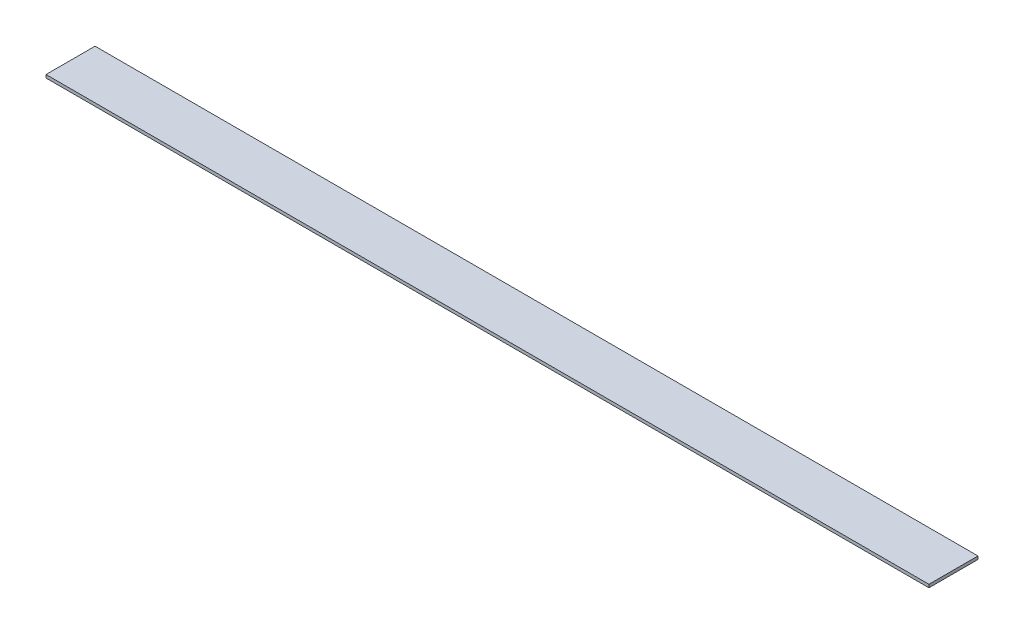
ISO-10303-21;
HEADER;
FILE_DESCRIPTION(('STEP AP214'),'2;1');
FILE_NAME('part.step','',(''),(''),'','','');
FILE_SCHEMA(('AUTOMOTIVE_DESIGN { 1 0 10303 214 1 1 1 1 }'));
ENDSEC;
DATA;
#1=APPLICATION_CONTEXT('core data for automotive mechanical design processes');
#2=APPLICATION_PROTOCOL_DEFINITION('international standard','automotive_design',2000,#1);
#3=PRODUCT_CONTEXT('',#1,'mechanical');
#4=PRODUCT('Part','Part','',(#3));
#5=PRODUCT_RELATED_PRODUCT_CATEGORY('part','',(#4));
#6=PRODUCT_DEFINITION_FORMATION('','',#4);
#7=PRODUCT_DEFINITION_CONTEXT('part definition',#1,'design');
#8=PRODUCT_DEFINITION('design','',#6,#7);
#9=PRODUCT_DEFINITION_SHAPE('','',#8);
#10=(LENGTH_UNIT() NAMED_UNIT(*) SI_UNIT(.MILLI.,.METRE.));
#11=(NAMED_UNIT(*) PLANE_ANGLE_UNIT() SI_UNIT($,.RADIAN.));
#12=(NAMED_UNIT(*) SI_UNIT($,.STERADIAN.) SOLID_ANGLE_UNIT());
#13=UNCERTAINTY_MEASURE_WITH_UNIT(LENGTH_MEASURE(1.E-05),#10,'distance_accuracy_value','');
#14=(GEOMETRIC_REPRESENTATION_CONTEXT(3) GLOBAL_UNCERTAINTY_ASSIGNED_CONTEXT((#13)) GLOBAL_UNIT_ASSIGNED_CONTEXT((#10,
#11,#12)) REPRESENTATION_CONTEXT('',''));
#15=CARTESIAN_POINT('',(0.,0.,0.));
#16=DIRECTION('',(0.,0.,1.));
#17=DIRECTION('',(1.,0.,0.));
#18=AXIS2_PLACEMENT_3D('',#15,#16,#17);
#19=CARTESIAN_POINT('',(-457.2,3.175,-25.3999999999999));
#20=DIRECTION('',(1.,0.,0.));
#21=DIRECTION('',(0.,0.,-1.));
#22=AXIS2_PLACEMENT_3D('',#19,#20,#21);
#23=PLANE('',#22);
#24=DIRECTION('',(0.,0.,1.));
#25=VECTOR('',#24,1.);
#26=CARTESIAN_POINT('',(-457.2,0.,-25.3999999999999));
#27=LINE('',#26,#25);
#28=CARTESIAN_POINT('',(-457.2,0.,-25.3999999999999));
#29=VERTEX_POINT('',#28);
#30=CARTESIAN_POINT('',(-457.2,0.,25.4000000000001));
#31=VERTEX_POINT('',#30);
#32=EDGE_CURVE('E98',#29,#31,#27,.T.);
#33=ORIENTED_EDGE('',*,*,#32,.T.);
#34=DIRECTION('',(0.,-1.,0.));
#35=VECTOR('',#34,1.);
#36=CARTESIAN_POINT('',(-457.2,3.175,25.4000000000001));
#37=LINE('',#36,#35);
#38=CARTESIAN_POINT('',(-457.2,3.175,25.4000000000001));
#39=VERTEX_POINT('',#38);
#40=EDGE_CURVE('E11',#39,#31,#37,.T.);
#41=ORIENTED_EDGE('',*,*,#40,.F.);
#42=DIRECTION('',(0.,0.,1.));
#43=VECTOR('',#42,1.);
#44=CARTESIAN_POINT('',(-457.2,3.175,-25.3999999999999));
#45=LINE('',#44,#43);
#46=CARTESIAN_POINT('',(-457.2,3.175,-25.3999999999999));
#47=VERTEX_POINT('',#46);
#48=EDGE_CURVE('E86',#47,#39,#45,.T.);
#49=ORIENTED_EDGE('',*,*,#48,.F.);
#50=DIRECTION('',(0.,-1.,0.));
#51=VECTOR('',#50,1.);
#52=CARTESIAN_POINT('',(-457.2,3.175,-25.3999999999999));
#53=LINE('',#52,#51);
#54=EDGE_CURVE('E94',#47,#29,#53,.T.);
#55=ORIENTED_EDGE('',*,*,#54,.T.);
#56=EDGE_LOOP('',(#33,#41,#49,#55));
#57=FACE_BOUND('',#56,.T.);
#58=ADVANCED_FACE('F35',(#57),#23,.F.);
#59=CARTESIAN_POINT('',(457.2,3.175,25.3999999999999));
#60=DIRECTION('',(0.,0.,-1.));
#61=DIRECTION('',(-1.,0.,0.));
#62=AXIS2_PLACEMENT_3D('',#59,#60,#61);
#63=PLANE('',#62);
#64=DIRECTION('',(1.,0.,0.));
#65=VECTOR('',#64,1.);
#66=CARTESIAN_POINT('',(457.2,0.,25.3999999999999));
#67=LINE('',#66,#65);
#68=CARTESIAN_POINT('',(457.2,0.,25.3999999999999));
#69=VERTEX_POINT('',#68);
#70=EDGE_CURVE('E90',#31,#69,#67,.T.);
#71=ORIENTED_EDGE('',*,*,#70,.T.);
#72=DIRECTION('',(0.,-1.,0.));
#73=VECTOR('',#72,1.);
#74=CARTESIAN_POINT('',(457.2,3.175,25.3999999999999));
#75=LINE('',#74,#73);
#76=CARTESIAN_POINT('',(457.2,3.175,25.3999999999999));
#77=VERTEX_POINT('',#76);
#78=EDGE_CURVE('E43',#77,#69,#75,.T.);
#79=ORIENTED_EDGE('',*,*,#78,.F.);
#80=DIRECTION('',(1.,0.,0.));
#81=VECTOR('',#80,1.);
#82=CARTESIAN_POINT('',(457.2,3.175,25.3999999999999));
#83=LINE('',#82,#81);
#84=EDGE_CURVE('E81',#39,#77,#83,.T.);
#85=ORIENTED_EDGE('',*,*,#84,.F.);
#86=ORIENTED_EDGE('',*,*,#40,.T.);
#87=EDGE_LOOP('',(#71,#79,#85,#86));
#88=FACE_BOUND('',#87,.T.);
#89=ADVANCED_FACE('F89',(#88),#63,.F.);
#90=CARTESIAN_POINT('',(457.2,3.175,-25.4));
#91=DIRECTION('',(-1.,0.,0.));
#92=DIRECTION('',(0.,0.,1.));
#93=AXIS2_PLACEMENT_3D('',#90,#91,#92);
#94=PLANE('',#93);
#95=DIRECTION('',(0.,0.,-1.));
#96=VECTOR('',#95,1.);
#97=CARTESIAN_POINT('',(457.2,0.,-25.4));
#98=LINE('',#97,#96);
#99=CARTESIAN_POINT('',(457.2,0.,-25.4));
#100=VERTEX_POINT('',#99);
#101=EDGE_CURVE('E68',#69,#100,#98,.T.);
#102=ORIENTED_EDGE('',*,*,#101,.T.);
#103=DIRECTION('',(0.,-1.,0.));
#104=VECTOR('',#103,1.);
#105=CARTESIAN_POINT('',(457.2,3.175,-25.4));
#106=LINE('',#105,#104);
#107=CARTESIAN_POINT('',(457.2,3.175,-25.4));
#108=VERTEX_POINT('',#107);
#109=EDGE_CURVE('E91',#108,#100,#106,.T.);
#110=ORIENTED_EDGE('',*,*,#109,.F.);
#111=DIRECTION('',(0.,0.,-1.));
#112=VECTOR('',#111,1.);
#113=CARTESIAN_POINT('',(457.2,3.175,-25.4));
#114=LINE('',#113,#112);
#115=EDGE_CURVE('E84',#77,#108,#114,.T.);
#116=ORIENTED_EDGE('',*,*,#115,.F.);
#117=ORIENTED_EDGE('',*,*,#78,.T.);
#118=EDGE_LOOP('',(#102,#110,#116,#117));
#119=FACE_BOUND('',#118,.T.);
#120=ADVANCED_FACE('F92',(#119),#94,.F.);
#121=CARTESIAN_POINT('',(457.2,3.175,-25.4));
#122=DIRECTION('',(0.,0.,1.));
#123=DIRECTION('',(1.,0.,0.));
#124=AXIS2_PLACEMENT_3D('',#121,#122,#123);
#125=PLANE('',#124);
#126=DIRECTION('',(-1.,0.,0.));
#127=VECTOR('',#126,1.);
#128=CARTESIAN_POINT('',(457.2,0.,-25.4));
#129=LINE('',#128,#127);
#130=EDGE_CURVE('E74',#100,#29,#129,.T.);
#131=ORIENTED_EDGE('',*,*,#130,.T.);
#132=ORIENTED_EDGE('',*,*,#54,.F.);
#133=DIRECTION('',(-1.,0.,0.));
#134=VECTOR('',#133,1.);
#135=CARTESIAN_POINT('',(457.2,3.175,-25.4));
#136=LINE('',#135,#134);
#137=EDGE_CURVE('E51',#108,#47,#136,.T.);
#138=ORIENTED_EDGE('',*,*,#137,.F.);
#139=ORIENTED_EDGE('',*,*,#109,.T.);
#140=EDGE_LOOP('',(#131,#132,#138,#139));
#141=FACE_BOUND('',#140,.T.);
#142=ADVANCED_FACE('F105',(#141),#125,.F.);
#143=CARTESIAN_POINT('',(0.,3.175,0.));
#144=DIRECTION('',(0.,-1.,0.));
#145=DIRECTION('',(0.,0.,-1.));
#146=AXIS2_PLACEMENT_3D('',#143,#144,#145);
#147=PLANE('',#146);
#148=ORIENTED_EDGE('',*,*,#48,.T.);
#149=ORIENTED_EDGE('',*,*,#84,.T.);
#150=ORIENTED_EDGE('',*,*,#115,.T.);
#151=ORIENTED_EDGE('',*,*,#137,.T.);
#152=EDGE_LOOP('',(#148,#149,#150,#151));
#153=FACE_BOUND('',#152,.T.);
#154=ADVANCED_FACE('F82',(#153),#147,.F.);
#155=CARTESIAN_POINT('',(0.,0.,0.));
#156=DIRECTION('',(0.,-1.,0.));
#157=DIRECTION('',(0.,0.,-1.));
#158=AXIS2_PLACEMENT_3D('',#155,#156,#157);
#159=PLANE('',#158);
#160=ORIENTED_EDGE('',*,*,#32,.F.);
#161=ORIENTED_EDGE('',*,*,#130,.F.);
#162=ORIENTED_EDGE('',*,*,#101,.F.);
#163=ORIENTED_EDGE('',*,*,#70,.F.);
#164=EDGE_LOOP('',(#160,#161,#162,#163));
#165=FACE_BOUND('',#164,.T.);
#166=ADVANCED_FACE('F108',(#165),#159,.T.);
#167=CLOSED_SHELL('',(#58,#89,#120,#142,#154,#166));
#168=MANIFOLD_SOLID_BREP('B2',#167);
#169=ADVANCED_BREP_SHAPE_REPRESENTATION('',(#18,#168),#14);
#170=SHAPE_DEFINITION_REPRESENTATION(#9,#169);
ENDSEC;
END-ISO-10303-21;
